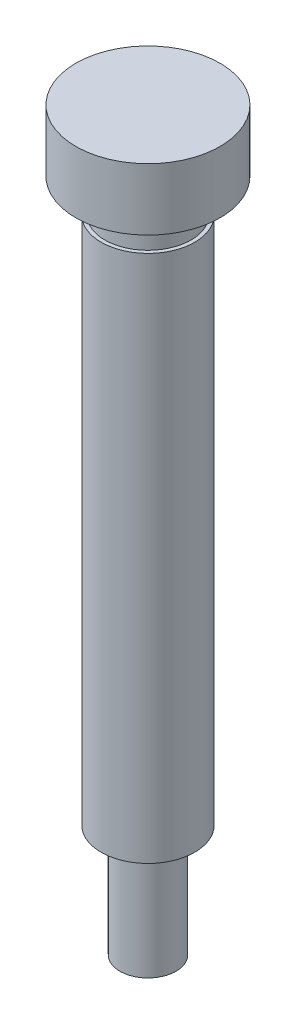
ISO-10303-21;
HEADER;
FILE_DESCRIPTION(('STEP AP214'),'2;1');
FILE_NAME('part.step','',(''),(''),'','','');
FILE_SCHEMA(('AUTOMOTIVE_DESIGN { 1 0 10303 214 1 1 1 1 }'));
ENDSEC;
DATA;
#1=APPLICATION_CONTEXT('core data for automotive mechanical design processes');
#2=APPLICATION_PROTOCOL_DEFINITION('international standard','automotive_design',2000,#1);
#3=PRODUCT_CONTEXT('',#1,'mechanical');
#4=PRODUCT('Part','Part','',(#3));
#5=PRODUCT_RELATED_PRODUCT_CATEGORY('part','',(#4));
#6=PRODUCT_DEFINITION_FORMATION('','',#4);
#7=PRODUCT_DEFINITION_CONTEXT('part definition',#1,'design');
#8=PRODUCT_DEFINITION('design','',#6,#7);
#9=PRODUCT_DEFINITION_SHAPE('','',#8);
#10=(LENGTH_UNIT() NAMED_UNIT(*) SI_UNIT(.MILLI.,.METRE.));
#11=(NAMED_UNIT(*) PLANE_ANGLE_UNIT() SI_UNIT($,.RADIAN.));
#12=(NAMED_UNIT(*) SI_UNIT($,.STERADIAN.) SOLID_ANGLE_UNIT());
#13=UNCERTAINTY_MEASURE_WITH_UNIT(LENGTH_MEASURE(1.E-05),#10,'distance_accuracy_value','');
#14=(GEOMETRIC_REPRESENTATION_CONTEXT(3) GLOBAL_UNCERTAINTY_ASSIGNED_CONTEXT((#13)) GLOBAL_UNIT_ASSIGNED_CONTEXT((#10,
#11,#12)) REPRESENTATION_CONTEXT('',''));
#15=CARTESIAN_POINT('',(0.,0.,0.));
#16=DIRECTION('',(0.,0.,1.));
#17=DIRECTION('',(1.,0.,0.));
#18=AXIS2_PLACEMENT_3D('',#15,#16,#17);
#19=CARTESIAN_POINT('',(0.,0.,0.));
#20=DIRECTION('',(0.,1.,0.));
#21=DIRECTION('',(-1.,0.,0.));
#22=AXIS2_PLACEMENT_3D('',#19,#20,#21);
#23=PLANE('',#22);
#24=CARTESIAN_POINT('',(0.,0.,0.));
#25=DIRECTION('',(0.,1.,0.));
#26=DIRECTION('',(-1.,0.,0.));
#27=AXIS2_PLACEMENT_3D('',#24,#25,#26);
#28=CIRCLE('',#27,1.5);
#29=CARTESIAN_POINT('',(-1.5,0.,0.));
#30=VERTEX_POINT('',#29);
#31=EDGE_CURVE('E10',#30,#30,#28,.T.);
#32=ORIENTED_EDGE('',*,*,#31,.F.);
#33=EDGE_LOOP('',(#32));
#34=FACE_BOUND('',#33,.T.);
#35=ADVANCED_FACE('F31',(#34),#23,.F.);
#36=CARTESIAN_POINT('',(0.,39.3,0.));
#37=DIRECTION('',(0.,1.,0.));
#38=DIRECTION('',(-1.,0.,0.));
#39=AXIS2_PLACEMENT_3D('',#36,#37,#38);
#40=CYLINDRICAL_SURFACE('',#39,1.5);
#41=CARTESIAN_POINT('',(0.,6.,0.));
#42=DIRECTION('',(0.,1.,0.));
#43=DIRECTION('',(-1.,0.,0.));
#44=AXIS2_PLACEMENT_3D('',#41,#42,#43);
#45=CIRCLE('',#44,1.5);
#46=CARTESIAN_POINT('',(-1.5,6.,0.));
#47=VERTEX_POINT('',#46);
#48=EDGE_CURVE('E37',#47,#47,#45,.T.);
#49=ORIENTED_EDGE('',*,*,#48,.F.);
#50=EDGE_LOOP('',(#49));
#51=FACE_BOUND('',#50,.T.);
#52=ORIENTED_EDGE('',*,*,#31,.T.);
#53=EDGE_LOOP('',(#52));
#54=FACE_BOUND('',#53,.T.);
#55=ADVANCED_FACE('F97',(#51,#54),#40,.T.);
#56=CARTESIAN_POINT('',(1.5,6.,0.));
#57=DIRECTION('',(0.,1.,0.));
#58=DIRECTION('',(-1.,0.,0.));
#59=AXIS2_PLACEMENT_3D('',#56,#57,#58);
#60=PLANE('',#59);
#61=CARTESIAN_POINT('',(0.,6.,0.));
#62=DIRECTION('',(0.,1.,0.));
#63=DIRECTION('',(-1.,0.,0.));
#64=AXIS2_PLACEMENT_3D('',#61,#62,#63);
#65=CIRCLE('',#64,2.50000000000001);
#66=CARTESIAN_POINT('',(-2.50000000000001,6.,0.));
#67=VERTEX_POINT('',#66);
#68=EDGE_CURVE('E41',#67,#67,#65,.T.);
#69=ORIENTED_EDGE('',*,*,#68,.F.);
#70=EDGE_LOOP('',(#69));
#71=FACE_BOUND('',#70,.T.);
#72=ORIENTED_EDGE('',*,*,#48,.T.);
#73=EDGE_LOOP('',(#72));
#74=FACE_BOUND('',#73,.T.);
#75=ADVANCED_FACE('F92',(#71,#74),#60,.F.);
#76=CARTESIAN_POINT('',(0.,39.3,0.));
#77=DIRECTION('',(0.,1.,0.));
#78=DIRECTION('',(-1.,0.,0.));
#79=AXIS2_PLACEMENT_3D('',#76,#77,#78);
#80=CYLINDRICAL_SURFACE('',#79,2.5);
#81=CARTESIAN_POINT('',(0.,34.2,0.));
#82=DIRECTION('',(0.,1.,0.));
#83=DIRECTION('',(-1.,0.,0.));
#84=AXIS2_PLACEMENT_3D('',#81,#82,#83);
#85=CIRCLE('',#84,2.5);
#86=CARTESIAN_POINT('',(-2.50000000000001,34.2,0.));
#87=VERTEX_POINT('',#86);
#88=EDGE_CURVE('E45',#87,#87,#85,.T.);
#89=ORIENTED_EDGE('',*,*,#88,.F.);
#90=EDGE_LOOP('',(#89));
#91=FACE_BOUND('',#90,.T.);
#92=ORIENTED_EDGE('',*,*,#68,.T.);
#93=EDGE_LOOP('',(#92));
#94=FACE_BOUND('',#93,.T.);
#95=ADVANCED_FACE('F86',(#91,#94),#80,.T.);
#96=CARTESIAN_POINT('',(2.3,34.2,0.));
#97=DIRECTION('',(0.,-1.,0.));
#98=DIRECTION('',(1.,0.,0.));
#99=AXIS2_PLACEMENT_3D('',#96,#97,#98);
#100=PLANE('',#99);
#101=CARTESIAN_POINT('',(0.,34.2,0.));
#102=DIRECTION('',(0.,1.,0.));
#103=DIRECTION('',(-1.,0.,0.));
#104=AXIS2_PLACEMENT_3D('',#101,#102,#103);
#105=CIRCLE('',#104,2.3);
#106=CARTESIAN_POINT('',(-2.3,34.2,0.));
#107=VERTEX_POINT('',#106);
#108=EDGE_CURVE('E50',#107,#107,#105,.T.);
#109=ORIENTED_EDGE('',*,*,#108,.F.);
#110=EDGE_LOOP('',(#109));
#111=FACE_BOUND('',#110,.T.);
#112=ORIENTED_EDGE('',*,*,#88,.T.);
#113=EDGE_LOOP('',(#112));
#114=FACE_BOUND('',#113,.T.);
#115=ADVANCED_FACE('F80',(#111,#114),#100,.F.);
#116=CARTESIAN_POINT('',(0.,39.3,0.));
#117=DIRECTION('',(0.,1.,0.));
#118=DIRECTION('',(-1.,0.,0.));
#119=AXIS2_PLACEMENT_3D('',#116,#117,#118);
#120=CYLINDRICAL_SURFACE('',#119,2.3);
#121=CARTESIAN_POINT('',(0.,36.,0.));
#122=DIRECTION('',(0.,1.,0.));
#123=DIRECTION('',(-1.,0.,0.));
#124=AXIS2_PLACEMENT_3D('',#121,#122,#123);
#125=CIRCLE('',#124,2.3);
#126=CARTESIAN_POINT('',(-2.3,36.,0.));
#127=VERTEX_POINT('',#126);
#128=EDGE_CURVE('E53',#127,#127,#125,.T.);
#129=ORIENTED_EDGE('',*,*,#128,.F.);
#130=EDGE_LOOP('',(#129));
#131=FACE_BOUND('',#130,.T.);
#132=ORIENTED_EDGE('',*,*,#108,.T.);
#133=EDGE_LOOP('',(#132));
#134=FACE_BOUND('',#133,.T.);
#135=ADVANCED_FACE('F74',(#131,#134),#120,.T.);
#136=CARTESIAN_POINT('',(2.3,36.,0.));
#137=DIRECTION('',(0.,1.,0.));
#138=DIRECTION('',(-1.,0.,0.));
#139=AXIS2_PLACEMENT_3D('',#136,#137,#138);
#140=PLANE('',#139);
#141=CARTESIAN_POINT('',(0.,36.,0.));
#142=DIRECTION('',(0.,1.,0.));
#143=DIRECTION('',(-1.,0.,0.));
#144=AXIS2_PLACEMENT_3D('',#141,#142,#143);
#145=CIRCLE('',#144,3.85);
#146=CARTESIAN_POINT('',(-3.85,36.,0.));
#147=VERTEX_POINT('',#146);
#148=EDGE_CURVE('E56',#147,#147,#145,.T.);
#149=ORIENTED_EDGE('',*,*,#148,.F.);
#150=EDGE_LOOP('',(#149));
#151=FACE_BOUND('',#150,.T.);
#152=ORIENTED_EDGE('',*,*,#128,.T.);
#153=EDGE_LOOP('',(#152));
#154=FACE_BOUND('',#153,.T.);
#155=ADVANCED_FACE('F68',(#151,#154),#140,.F.);
#156=CARTESIAN_POINT('',(0.,39.3,0.));
#157=DIRECTION('',(0.,1.,0.));
#158=DIRECTION('',(-1.,0.,0.));
#159=AXIS2_PLACEMENT_3D('',#156,#157,#158);
#160=CYLINDRICAL_SURFACE('',#159,3.85);
#161=CARTESIAN_POINT('',(0.,39.3,0.));
#162=DIRECTION('',(0.,1.,0.));
#163=DIRECTION('',(-1.,0.,0.));
#164=AXIS2_PLACEMENT_3D('',#161,#162,#163);
#165=CIRCLE('',#164,3.85);
#166=CARTESIAN_POINT('',(-3.85000000000001,39.3,0.));
#167=VERTEX_POINT('',#166);
#168=EDGE_CURVE('E59',#167,#167,#165,.T.);
#169=ORIENTED_EDGE('',*,*,#168,.F.);
#170=EDGE_LOOP('',(#169));
#171=FACE_BOUND('',#170,.T.);
#172=ORIENTED_EDGE('',*,*,#148,.T.);
#173=EDGE_LOOP('',(#172));
#174=FACE_BOUND('',#173,.T.);
#175=ADVANCED_FACE('F65',(#171,#174),#160,.T.);
#176=CARTESIAN_POINT('',(3.85,39.3,0.));
#177=DIRECTION('',(0.,-1.,0.));
#178=DIRECTION('',(1.,0.,0.));
#179=AXIS2_PLACEMENT_3D('',#176,#177,#178);
#180=PLANE('',#179);
#181=ORIENTED_EDGE('',*,*,#168,.T.);
#182=EDGE_LOOP('',(#181));
#183=FACE_BOUND('',#182,.T.);
#184=ADVANCED_FACE('F63',(#183),#180,.F.);
#185=CLOSED_SHELL('',(#35,#55,#75,#95,#115,#135,#155,#175,#184));
#186=MANIFOLD_SOLID_BREP('B2',#185);
#187=ADVANCED_BREP_SHAPE_REPRESENTATION('',(#18,#186),#14);
#188=SHAPE_DEFINITION_REPRESENTATION(#9,#187);
ENDSEC;
END-ISO-10303-21;
